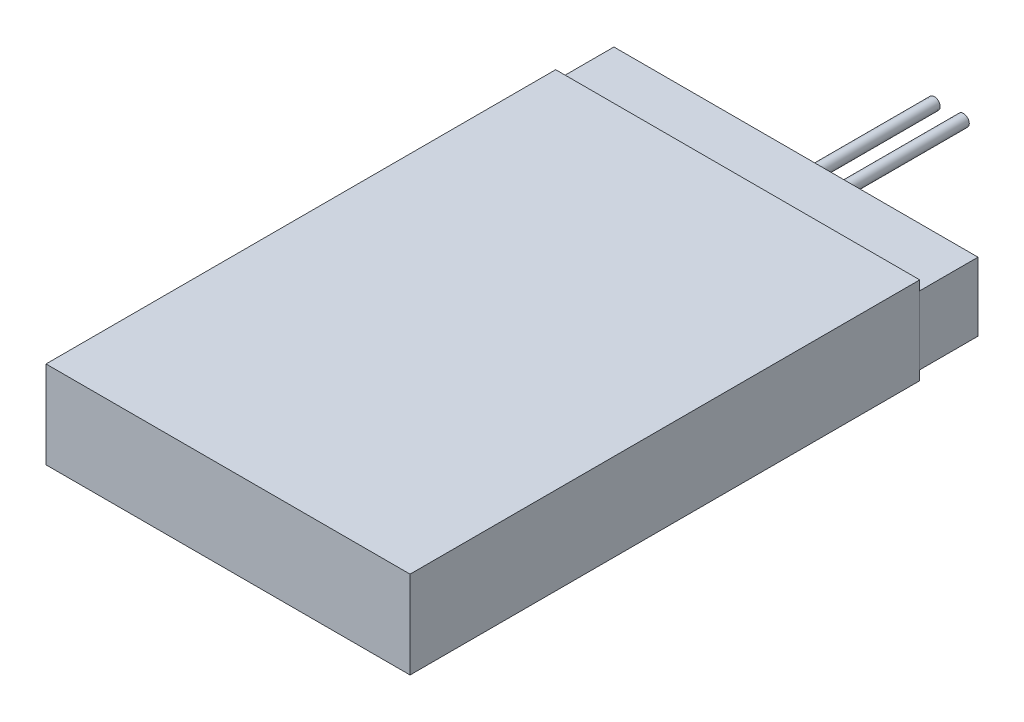
ISO-10303-21;
HEADER;
FILE_DESCRIPTION(('STEP AP214'),'2;1');
FILE_NAME('part.step','',(''),(''),'','','');
FILE_SCHEMA(('AUTOMOTIVE_DESIGN { 1 0 10303 214 1 1 1 1 }'));
ENDSEC;
DATA;
#1=APPLICATION_CONTEXT('core data for automotive mechanical design processes');
#2=APPLICATION_PROTOCOL_DEFINITION('international standard','automotive_design',2000,#1);
#3=PRODUCT_CONTEXT('',#1,'mechanical');
#4=PRODUCT('Part','Part','',(#3));
#5=PRODUCT_RELATED_PRODUCT_CATEGORY('part','',(#4));
#6=PRODUCT_DEFINITION_FORMATION('','',#4);
#7=PRODUCT_DEFINITION_CONTEXT('part definition',#1,'design');
#8=PRODUCT_DEFINITION('design','',#6,#7);
#9=PRODUCT_DEFINITION_SHAPE('','',#8);
#10=(LENGTH_UNIT() NAMED_UNIT(*) SI_UNIT(.MILLI.,.METRE.));
#11=(NAMED_UNIT(*) PLANE_ANGLE_UNIT() SI_UNIT($,.RADIAN.));
#12=(NAMED_UNIT(*) SI_UNIT($,.STERADIAN.) SOLID_ANGLE_UNIT());
#13=UNCERTAINTY_MEASURE_WITH_UNIT(LENGTH_MEASURE(1.E-05),#10,'distance_accuracy_value','');
#14=(GEOMETRIC_REPRESENTATION_CONTEXT(3) GLOBAL_UNCERTAINTY_ASSIGNED_CONTEXT((#13)) GLOBAL_UNIT_ASSIGNED_CONTEXT((#10,
#11,#12)) REPRESENTATION_CONTEXT('',''));
#15=CARTESIAN_POINT('',(0.,0.,0.));
#16=DIRECTION('',(0.,0.,1.));
#17=DIRECTION('',(1.,0.,0.));
#18=AXIS2_PLACEMENT_3D('',#15,#16,#17);
#19=CARTESIAN_POINT('',(12.,3.,-49.));
#20=DIRECTION('',(0.,0.,1.));
#21=DIRECTION('',(1.,0.,0.));
#22=AXIS2_PLACEMENT_3D('',#19,#20,#21);
#23=CYLINDRICAL_SURFACE('',#22,0.399999999999999);
#24=CARTESIAN_POINT('',(12.,3.,-49.));
#25=DIRECTION('',(0.,0.,-1.));
#26=DIRECTION('',(-1.,0.,0.));
#27=AXIS2_PLACEMENT_3D('',#24,#25,#26);
#28=CIRCLE('',#27,0.399999999999999);
#29=CARTESIAN_POINT('',(11.6,3.,-49.));
#30=VERTEX_POINT('',#29);
#31=EDGE_CURVE('E56',#30,#30,#28,.T.);
#32=ORIENTED_EDGE('',*,*,#31,.F.);
#33=EDGE_LOOP('',(#32));
#34=FACE_BOUND('',#33,.T.);
#35=CARTESIAN_POINT('',(12.,3.,-39.));
#36=DIRECTION('',(0.,0.,-1.));
#37=DIRECTION('',(-1.,0.,0.));
#38=AXIS2_PLACEMENT_3D('',#35,#36,#37);
#39=CIRCLE('',#38,0.399999999999999);
#40=CARTESIAN_POINT('',(11.6,3.,-39.));
#41=VERTEX_POINT('',#40);
#42=EDGE_CURVE('E11',#41,#41,#39,.T.);
#43=ORIENTED_EDGE('',*,*,#42,.T.);
#44=EDGE_LOOP('',(#43));
#45=FACE_BOUND('',#44,.T.);
#46=ADVANCED_FACE('F52',(#34,#45),#23,.T.);
#47=CARTESIAN_POINT('',(12.,3.,-49.));
#48=DIRECTION('',(0.,0.,-1.));
#49=DIRECTION('',(-1.,0.,0.));
#50=AXIS2_PLACEMENT_3D('',#47,#48,#49);
#51=PLANE('',#50);
#52=ORIENTED_EDGE('',*,*,#31,.T.);
#53=EDGE_LOOP('',(#52));
#54=FACE_BOUND('',#53,.T.);
#55=ADVANCED_FACE('F54',(#54),#51,.T.);
#56=CARTESIAN_POINT('',(12.,3.,-39.));
#57=DIRECTION('',(0.,0.,-1.));
#58=DIRECTION('',(-1.,0.,0.));
#59=AXIS2_PLACEMENT_3D('',#56,#57,#58);
#60=PLANE('',#59);
#61=ORIENTED_EDGE('',*,*,#42,.F.);
#62=EDGE_LOOP('',(#61));
#63=FACE_BOUND('',#62,.T.);
#64=ADVANCED_FACE('F71',(#63),#60,.F.);
#65=CLOSED_SHELL('',(#46,#55,#64));
#66=MANIFOLD_SOLID_BREP('B2',#65);
#67=CARTESIAN_POINT('',(14.,3.,-49.));
#68=DIRECTION('',(0.,0.,1.));
#69=DIRECTION('',(1.,0.,0.));
#70=AXIS2_PLACEMENT_3D('',#67,#68,#69);
#71=CYLINDRICAL_SURFACE('',#70,0.400000000000001);
#72=CARTESIAN_POINT('',(14.,3.,-49.));
#73=DIRECTION('',(0.,0.,-1.));
#74=DIRECTION('',(-1.,0.,0.));
#75=AXIS2_PLACEMENT_3D('',#72,#73,#74);
#76=CIRCLE('',#75,0.400000000000001);
#77=CARTESIAN_POINT('',(13.6,3.,-49.));
#78=VERTEX_POINT('',#77);
#79=EDGE_CURVE('E51',#78,#78,#76,.T.);
#80=ORIENTED_EDGE('',*,*,#79,.F.);
#81=EDGE_LOOP('',(#80));
#82=FACE_BOUND('',#81,.T.);
#83=CARTESIAN_POINT('',(14.,3.,-39.));
#84=DIRECTION('',(0.,0.,-1.));
#85=DIRECTION('',(-1.,0.,0.));
#86=AXIS2_PLACEMENT_3D('',#83,#84,#85);
#87=CIRCLE('',#86,0.400000000000001);
#88=CARTESIAN_POINT('',(13.6,3.,-39.));
#89=VERTEX_POINT('',#88);
#90=EDGE_CURVE('E118',#89,#89,#87,.T.);
#91=ORIENTED_EDGE('',*,*,#90,.T.);
#92=EDGE_LOOP('',(#91));
#93=FACE_BOUND('',#92,.T.);
#94=ADVANCED_FACE('F115',(#82,#93),#71,.T.);
#95=CARTESIAN_POINT('',(14.,3.,-49.));
#96=DIRECTION('',(0.,0.,-1.));
#97=DIRECTION('',(-1.,0.,0.));
#98=AXIS2_PLACEMENT_3D('',#95,#96,#97);
#99=PLANE('',#98);
#100=ORIENTED_EDGE('',*,*,#79,.T.);
#101=EDGE_LOOP('',(#100));
#102=FACE_BOUND('',#101,.T.);
#103=ADVANCED_FACE('F130',(#102),#99,.T.);
#104=CARTESIAN_POINT('',(14.,3.,-39.));
#105=DIRECTION('',(0.,0.,-1.));
#106=DIRECTION('',(-1.,0.,0.));
#107=AXIS2_PLACEMENT_3D('',#104,#105,#106);
#108=PLANE('',#107);
#109=ORIENTED_EDGE('',*,*,#90,.F.);
#110=EDGE_LOOP('',(#109));
#111=FACE_BOUND('',#110,.T.);
#112=ADVANCED_FACE('F128',(#111),#108,.F.);
#113=CLOSED_SHELL('',(#94,#103,#112));
#114=MANIFOLD_SOLID_BREP('B6',#113);
#115=CARTESIAN_POINT('',(-6.17170964968379,5.35,-35.));
#116=DIRECTION('',(0.,0.,1.));
#117=DIRECTION('',(1.,0.,0.));
#118=AXIS2_PLACEMENT_3D('',#115,#116,#117);
#119=PLANE('',#118);
#120=DIRECTION('',(0.,1.,0.));
#121=VECTOR('',#120,1.);
#122=CARTESIAN_POINT('',(0.,5.35,-35.));
#123=LINE('',#122,#121);
#124=CARTESIAN_POINT('',(0.,0.65,-35.));
#125=VERTEX_POINT('',#124);
#126=CARTESIAN_POINT('',(0.,5.35,-35.));
#127=VERTEX_POINT('',#126);
#128=EDGE_CURVE('E185',#125,#127,#123,.T.);
#129=ORIENTED_EDGE('',*,*,#128,.F.);
#130=DIRECTION('',(1.,0.,0.));
#131=VECTOR('',#130,1.);
#132=CARTESIAN_POINT('',(-6.17170964968379,0.65,-35.));
#133=LINE('',#132,#131);
#134=CARTESIAN_POINT('',(25.,0.65,-35.));
#135=VERTEX_POINT('',#134);
#136=EDGE_CURVE('E213',#125,#135,#133,.T.);
#137=ORIENTED_EDGE('',*,*,#136,.T.);
#138=DIRECTION('',(0.,-1.,0.));
#139=VECTOR('',#138,1.);
#140=CARTESIAN_POINT('',(25.,5.35,-35.));
#141=LINE('',#140,#139);
#142=CARTESIAN_POINT('',(25.,5.35,-35.));
#143=VERTEX_POINT('',#142);
#144=EDGE_CURVE('E217',#143,#135,#141,.T.);
#145=ORIENTED_EDGE('',*,*,#144,.F.);
#146=DIRECTION('',(1.,0.,0.));
#147=VECTOR('',#146,1.);
#148=CARTESIAN_POINT('',(-6.17170964968379,5.35,-35.));
#149=LINE('',#148,#147);
#150=EDGE_CURVE('E240',#127,#143,#149,.T.);
#151=ORIENTED_EDGE('',*,*,#150,.F.);
#152=EDGE_LOOP('',(#129,#137,#145,#151));
#153=FACE_BOUND('',#152,.T.);
#154=ADVANCED_FACE('F177',(#153),#119,.T.);
#155=CARTESIAN_POINT('',(-6.17170964968379,5.35,-35.));
#156=DIRECTION('',(0.,1.,0.));
#157=DIRECTION('',(0.,0.,1.));
#158=AXIS2_PLACEMENT_3D('',#155,#156,#157);
#159=PLANE('',#158);
#160=DIRECTION('',(0.,0.,-1.));
#161=VECTOR('',#160,1.);
#162=CARTESIAN_POINT('',(0.,5.35,-35.));
#163=LINE('',#162,#161);
#164=CARTESIAN_POINT('',(0.,5.35,-39.));
#165=VERTEX_POINT('',#164);
#166=EDGE_CURVE('E191',#127,#165,#163,.T.);
#167=ORIENTED_EDGE('',*,*,#166,.F.);
#168=ORIENTED_EDGE('',*,*,#150,.T.);
#169=DIRECTION('',(0.,0.,1.));
#170=VECTOR('',#169,1.);
#171=CARTESIAN_POINT('',(25.,5.35,-35.));
#172=LINE('',#171,#170);
#173=CARTESIAN_POINT('',(25.,5.35,-39.));
#174=VERTEX_POINT('',#173);
#175=EDGE_CURVE('E222',#174,#143,#172,.T.);
#176=ORIENTED_EDGE('',*,*,#175,.F.);
#177=DIRECTION('',(1.,0.,0.));
#178=VECTOR('',#177,1.);
#179=CARTESIAN_POINT('',(-6.17170964968379,5.35,-39.));
#180=LINE('',#179,#178);
#181=EDGE_CURVE('E243',#165,#174,#180,.T.);
#182=ORIENTED_EDGE('',*,*,#181,.F.);
#183=EDGE_LOOP('',(#167,#168,#176,#182));
#184=FACE_BOUND('',#183,.T.);
#185=ADVANCED_FACE('F249',(#184),#159,.T.);
#186=CARTESIAN_POINT('',(-6.17170964968379,5.35,-39.));
#187=DIRECTION('',(0.,0.,-1.));
#188=DIRECTION('',(-1.,0.,0.));
#189=AXIS2_PLACEMENT_3D('',#186,#187,#188);
#190=PLANE('',#189);
#191=DIRECTION('',(0.,-1.,0.));
#192=VECTOR('',#191,1.);
#193=CARTESIAN_POINT('',(0.,5.35,-39.));
#194=LINE('',#193,#192);
#195=CARTESIAN_POINT('',(0.,0.65,-39.));
#196=VERTEX_POINT('',#195);
#197=EDGE_CURVE('E242',#165,#196,#194,.T.);
#198=ORIENTED_EDGE('',*,*,#197,.F.);
#199=ORIENTED_EDGE('',*,*,#181,.T.);
#200=DIRECTION('',(0.,1.,0.));
#201=VECTOR('',#200,1.);
#202=CARTESIAN_POINT('',(25.,5.35,-39.));
#203=LINE('',#202,#201);
#204=CARTESIAN_POINT('',(25.,0.65,-39.));
#205=VERTEX_POINT('',#204);
#206=EDGE_CURVE('E230',#205,#174,#203,.T.);
#207=ORIENTED_EDGE('',*,*,#206,.F.);
#208=DIRECTION('',(1.,0.,0.));
#209=VECTOR('',#208,1.);
#210=CARTESIAN_POINT('',(-6.17170964968379,0.65,-39.));
#211=LINE('',#210,#209);
#212=EDGE_CURVE('E221',#196,#205,#211,.T.);
#213=ORIENTED_EDGE('',*,*,#212,.F.);
#214=EDGE_LOOP('',(#198,#199,#207,#213));
#215=FACE_BOUND('',#214,.T.);
#216=ADVANCED_FACE('F247',(#215),#190,.T.);
#217=CARTESIAN_POINT('',(-6.17170964968379,0.65,-35.));
#218=DIRECTION('',(0.,-1.,0.));
#219=DIRECTION('',(0.,0.,-1.));
#220=AXIS2_PLACEMENT_3D('',#217,#218,#219);
#221=PLANE('',#220);
#222=DIRECTION('',(0.,0.,1.));
#223=VECTOR('',#222,1.);
#224=CARTESIAN_POINT('',(0.,0.65,-35.));
#225=LINE('',#224,#223);
#226=EDGE_CURVE('E113',#196,#125,#225,.T.);
#227=ORIENTED_EDGE('',*,*,#226,.F.);
#228=ORIENTED_EDGE('',*,*,#212,.T.);
#229=DIRECTION('',(0.,0.,-1.));
#230=VECTOR('',#229,1.);
#231=CARTESIAN_POINT('',(25.,0.65,-35.));
#232=LINE('',#231,#230);
#233=EDGE_CURVE('E224',#135,#205,#232,.T.);
#234=ORIENTED_EDGE('',*,*,#233,.F.);
#235=ORIENTED_EDGE('',*,*,#136,.F.);
#236=EDGE_LOOP('',(#227,#228,#234,#235));
#237=FACE_BOUND('',#236,.T.);
#238=ADVANCED_FACE('F225',(#237),#221,.T.);
#239=CARTESIAN_POINT('',(25.,0.,0.));
#240=DIRECTION('',(1.,0.,0.));
#241=DIRECTION('',(0.,0.,-1.));
#242=AXIS2_PLACEMENT_3D('',#239,#240,#241);
#243=PLANE('',#242);
#244=ORIENTED_EDGE('',*,*,#144,.T.);
#245=ORIENTED_EDGE('',*,*,#233,.T.);
#246=ORIENTED_EDGE('',*,*,#206,.T.);
#247=ORIENTED_EDGE('',*,*,#175,.T.);
#248=EDGE_LOOP('',(#244,#245,#246,#247));
#249=FACE_BOUND('',#248,.T.);
#250=ADVANCED_FACE('F232',(#249),#243,.T.);
#251=CARTESIAN_POINT('',(0.,6.,0.));
#252=DIRECTION('',(1.,0.,0.));
#253=DIRECTION('',(0.,0.,-1.));
#254=AXIS2_PLACEMENT_3D('',#251,#252,#253);
#255=PLANE('',#254);
#256=ORIENTED_EDGE('',*,*,#128,.T.);
#257=ORIENTED_EDGE('',*,*,#166,.T.);
#258=ORIENTED_EDGE('',*,*,#197,.T.);
#259=ORIENTED_EDGE('',*,*,#226,.T.);
#260=EDGE_LOOP('',(#256,#257,#258,#259));
#261=FACE_BOUND('',#260,.T.);
#262=ADVANCED_FACE('F251',(#261),#255,.F.);
#263=CLOSED_SHELL('',(#154,#185,#216,#238,#250,#262));
#264=MANIFOLD_SOLID_BREP('B46',#263);
#265=CARTESIAN_POINT('',(0.,6.,0.));
#266=DIRECTION('',(1.,0.,0.));
#267=DIRECTION('',(0.,0.,-1.));
#268=AXIS2_PLACEMENT_3D('',#265,#266,#267);
#269=PLANE('',#268);
#270=DIRECTION('',(0.,0.,1.));
#271=VECTOR('',#270,1.);
#272=CARTESIAN_POINT('',(0.,0.,0.));
#273=LINE('',#272,#271);
#274=CARTESIAN_POINT('',(0.,0.,-35.));
#275=VERTEX_POINT('',#274);
#276=CARTESIAN_POINT('',(0.,0.,0.));
#277=VERTEX_POINT('',#276);
#278=EDGE_CURVE('E364',#275,#277,#273,.T.);
#279=ORIENTED_EDGE('',*,*,#278,.T.);
#280=DIRECTION('',(0.,-1.,0.));
#281=VECTOR('',#280,1.);
#282=CARTESIAN_POINT('',(0.,6.,0.));
#283=LINE('',#282,#281);
#284=CARTESIAN_POINT('',(0.,6.,0.));
#285=VERTEX_POINT('',#284);
#286=EDGE_CURVE('E175',#285,#277,#283,.T.);
#287=ORIENTED_EDGE('',*,*,#286,.F.);
#288=DIRECTION('',(0.,0.,1.));
#289=VECTOR('',#288,1.);
#290=CARTESIAN_POINT('',(0.,6.,0.));
#291=LINE('',#290,#289);
#292=CARTESIAN_POINT('',(0.,6.,-35.));
#293=VERTEX_POINT('',#292);
#294=EDGE_CURVE('E352',#293,#285,#291,.T.);
#295=ORIENTED_EDGE('',*,*,#294,.F.);
#296=DIRECTION('',(0.,-1.,0.));
#297=VECTOR('',#296,1.);
#298=CARTESIAN_POINT('',(0.,6.,-35.));
#299=LINE('',#298,#297);
#300=EDGE_CURVE('E360',#293,#275,#299,.T.);
#301=ORIENTED_EDGE('',*,*,#300,.T.);
#302=EDGE_LOOP('',(#279,#287,#295,#301));
#303=FACE_BOUND('',#302,.T.);
#304=ADVANCED_FACE('F301',(#303),#269,.F.);
#305=CARTESIAN_POINT('',(0.,6.,0.));
#306=DIRECTION('',(0.,0.,-1.));
#307=DIRECTION('',(-1.,0.,0.));
#308=AXIS2_PLACEMENT_3D('',#305,#306,#307);
#309=PLANE('',#308);
#310=DIRECTION('',(1.,0.,0.));
#311=VECTOR('',#310,1.);
#312=CARTESIAN_POINT('',(0.,0.,0.));
#313=LINE('',#312,#311);
#314=CARTESIAN_POINT('',(25.,0.,0.));
#315=VERTEX_POINT('',#314);
#316=EDGE_CURVE('E356',#277,#315,#313,.T.);
#317=ORIENTED_EDGE('',*,*,#316,.T.);
#318=DIRECTION('',(0.,-1.,0.));
#319=VECTOR('',#318,1.);
#320=CARTESIAN_POINT('',(25.,6.,0.));
#321=LINE('',#320,#319);
#322=CARTESIAN_POINT('',(25.,6.,0.));
#323=VERTEX_POINT('',#322);
#324=EDGE_CURVE('E309',#323,#315,#321,.T.);
#325=ORIENTED_EDGE('',*,*,#324,.F.);
#326=DIRECTION('',(1.,0.,0.));
#327=VECTOR('',#326,1.);
#328=CARTESIAN_POINT('',(0.,6.,0.));
#329=LINE('',#328,#327);
#330=EDGE_CURVE('E347',#285,#323,#329,.T.);
#331=ORIENTED_EDGE('',*,*,#330,.F.);
#332=ORIENTED_EDGE('',*,*,#286,.T.);
#333=EDGE_LOOP('',(#317,#325,#331,#332));
#334=FACE_BOUND('',#333,.T.);
#335=ADVANCED_FACE('F355',(#334),#309,.F.);
#336=CARTESIAN_POINT('',(25.,6.,0.));
#337=DIRECTION('',(-1.,0.,0.));
#338=DIRECTION('',(0.,0.,1.));
#339=AXIS2_PLACEMENT_3D('',#336,#337,#338);
#340=PLANE('',#339);
#341=DIRECTION('',(0.,0.,-1.));
#342=VECTOR('',#341,1.);
#343=CARTESIAN_POINT('',(25.,0.,0.));
#344=LINE('',#343,#342);
#345=CARTESIAN_POINT('',(25.,0.,-35.));
#346=VERTEX_POINT('',#345);
#347=EDGE_CURVE('E334',#315,#346,#344,.T.);
#348=ORIENTED_EDGE('',*,*,#347,.T.);
#349=DIRECTION('',(0.,-1.,0.));
#350=VECTOR('',#349,1.);
#351=CARTESIAN_POINT('',(25.,6.,-35.));
#352=LINE('',#351,#350);
#353=CARTESIAN_POINT('',(25.,6.,-35.));
#354=VERTEX_POINT('',#353);
#355=EDGE_CURVE('E357',#354,#346,#352,.T.);
#356=ORIENTED_EDGE('',*,*,#355,.F.);
#357=DIRECTION('',(0.,0.,-1.));
#358=VECTOR('',#357,1.);
#359=CARTESIAN_POINT('',(25.,6.,0.));
#360=LINE('',#359,#358);
#361=EDGE_CURVE('E350',#323,#354,#360,.T.);
#362=ORIENTED_EDGE('',*,*,#361,.F.);
#363=ORIENTED_EDGE('',*,*,#324,.T.);
#364=EDGE_LOOP('',(#348,#356,#362,#363));
#365=FACE_BOUND('',#364,.T.);
#366=ADVANCED_FACE('F358',(#365),#340,.F.);
#367=CARTESIAN_POINT('',(0.,6.,-35.));
#368=DIRECTION('',(0.,0.,1.));
#369=DIRECTION('',(1.,0.,0.));
#370=AXIS2_PLACEMENT_3D('',#367,#368,#369);
#371=PLANE('',#370);
#372=DIRECTION('',(-1.,0.,0.));
#373=VECTOR('',#372,1.);
#374=CARTESIAN_POINT('',(0.,0.,-35.));
#375=LINE('',#374,#373);
#376=EDGE_CURVE('E340',#346,#275,#375,.T.);
#377=ORIENTED_EDGE('',*,*,#376,.T.);
#378=ORIENTED_EDGE('',*,*,#300,.F.);
#379=DIRECTION('',(-1.,0.,0.));
#380=VECTOR('',#379,1.);
#381=CARTESIAN_POINT('',(0.,6.,-35.));
#382=LINE('',#381,#380);
#383=EDGE_CURVE('E317',#354,#293,#382,.T.);
#384=ORIENTED_EDGE('',*,*,#383,.F.);
#385=ORIENTED_EDGE('',*,*,#355,.T.);
#386=EDGE_LOOP('',(#377,#378,#384,#385));
#387=FACE_BOUND('',#386,.T.);
#388=ADVANCED_FACE('F371',(#387),#371,.F.);
#389=CARTESIAN_POINT('',(0.,6.,0.));
#390=DIRECTION('',(0.,-1.,0.));
#391=DIRECTION('',(0.,0.,-1.));
#392=AXIS2_PLACEMENT_3D('',#389,#390,#391);
#393=PLANE('',#392);
#394=ORIENTED_EDGE('',*,*,#294,.T.);
#395=ORIENTED_EDGE('',*,*,#330,.T.);
#396=ORIENTED_EDGE('',*,*,#361,.T.);
#397=ORIENTED_EDGE('',*,*,#383,.T.);
#398=EDGE_LOOP('',(#394,#395,#396,#397));
#399=FACE_BOUND('',#398,.T.);
#400=ADVANCED_FACE('F348',(#399),#393,.F.);
#401=CARTESIAN_POINT('',(0.,0.,0.));
#402=DIRECTION('',(0.,-1.,0.));
#403=DIRECTION('',(0.,0.,-1.));
#404=AXIS2_PLACEMENT_3D('',#401,#402,#403);
#405=PLANE('',#404);
#406=ORIENTED_EDGE('',*,*,#278,.F.);
#407=ORIENTED_EDGE('',*,*,#376,.F.);
#408=ORIENTED_EDGE('',*,*,#347,.F.);
#409=ORIENTED_EDGE('',*,*,#316,.F.);
#410=EDGE_LOOP('',(#406,#407,#408,#409));
#411=FACE_BOUND('',#410,.T.);
#412=ADVANCED_FACE('F374',(#411),#405,.T.);
#413=CLOSED_SHELL('',(#304,#335,#366,#388,#400,#412));
#414=MANIFOLD_SOLID_BREP('B107',#413);
#415=ADVANCED_BREP_SHAPE_REPRESENTATION('',(#18,#66,#114,#264,#414),#14);
#416=SHAPE_DEFINITION_REPRESENTATION(#9,#415);
ENDSEC;
END-ISO-10303-21;
